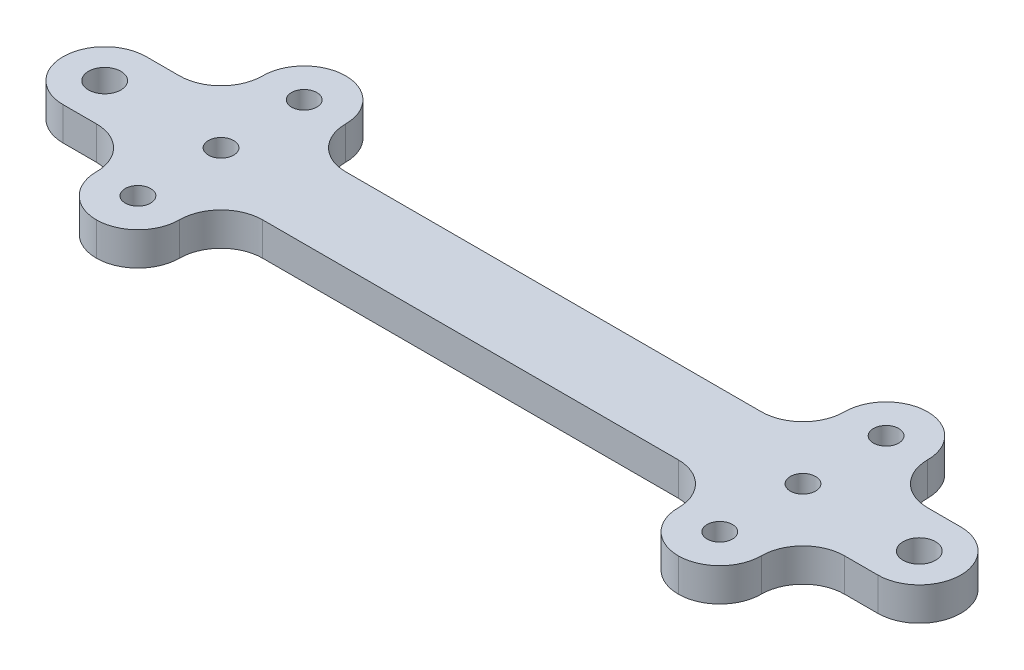
ISO-10303-21;
HEADER;
FILE_DESCRIPTION(('STEP AP214'),'2;1');
FILE_NAME('part.step','',(''),(''),'','','');
FILE_SCHEMA(('AUTOMOTIVE_DESIGN { 1 0 10303 214 1 1 1 1 }'));
ENDSEC;
DATA;
#1=APPLICATION_CONTEXT('core data for automotive mechanical design processes');
#2=APPLICATION_PROTOCOL_DEFINITION('international standard','automotive_design',2000,#1);
#3=PRODUCT_CONTEXT('',#1,'mechanical');
#4=PRODUCT('Part','Part','',(#3));
#5=PRODUCT_RELATED_PRODUCT_CATEGORY('part','',(#4));
#6=PRODUCT_DEFINITION_FORMATION('','',#4);
#7=PRODUCT_DEFINITION_CONTEXT('part definition',#1,'design');
#8=PRODUCT_DEFINITION('design','',#6,#7);
#9=PRODUCT_DEFINITION_SHAPE('','',#8);
#10=(LENGTH_UNIT() NAMED_UNIT(*) SI_UNIT(.MILLI.,.METRE.));
#11=(NAMED_UNIT(*) PLANE_ANGLE_UNIT() SI_UNIT($,.RADIAN.));
#12=(NAMED_UNIT(*) SI_UNIT($,.STERADIAN.) SOLID_ANGLE_UNIT());
#13=UNCERTAINTY_MEASURE_WITH_UNIT(LENGTH_MEASURE(1.E-05),#10,'distance_accuracy_value','');
#14=(GEOMETRIC_REPRESENTATION_CONTEXT(3) GLOBAL_UNCERTAINTY_ASSIGNED_CONTEXT((#13)) GLOBAL_UNIT_ASSIGNED_CONTEXT((#10,
#11,#12)) REPRESENTATION_CONTEXT('',''));
#15=CARTESIAN_POINT('',(0.,0.,0.));
#16=DIRECTION('',(0.,0.,1.));
#17=DIRECTION('',(1.,0.,0.));
#18=AXIS2_PLACEMENT_3D('',#15,#16,#17);
#19=CARTESIAN_POINT('',(-54.1,-23.5,0.));
#20=DIRECTION('',(0.,1.,0.));
#21=DIRECTION('',(0.,0.,1.));
#22=AXIS2_PLACEMENT_3D('',#19,#20,#21);
#23=PLANE('',#22);
#24=CARTESIAN_POINT('',(-40.1,-23.5,0.));
#25=DIRECTION('',(0.,1.,0.));
#26=DIRECTION('',(0.,0.,1.));
#27=AXIS2_PLACEMENT_3D('',#24,#25,#26);
#28=CIRCLE('',#27,1.525);
#29=CARTESIAN_POINT('',(-40.1,-23.5,1.52499999999997));
#30=VERTEX_POINT('',#29);
#31=EDGE_CURVE('E374',#30,#30,#28,.F.);
#32=ORIENTED_EDGE('',*,*,#31,.F.);
#33=EDGE_LOOP('',(#32));
#34=FACE_BOUND('',#33,.T.);
#35=CARTESIAN_POINT('',(-54.1,-23.5,0.));
#36=DIRECTION('',(0.,1.,0.));
#37=DIRECTION('',(0.,0.,1.));
#38=AXIS2_PLACEMENT_3D('',#35,#36,#37);
#39=CIRCLE('',#38,1.95);
#40=CARTESIAN_POINT('',(-54.1,-23.5,1.94999999999997));
#41=VERTEX_POINT('',#40);
#42=EDGE_CURVE('E427',#41,#41,#39,.T.);
#43=ORIENTED_EDGE('',*,*,#42,.T.);
#44=EDGE_LOOP('',(#43));
#45=FACE_BOUND('',#44,.T.);
#46=CARTESIAN_POINT('',(43.9,-23.5,0.));
#47=DIRECTION('',(0.,1.,0.));
#48=DIRECTION('',(0.,0.,1.));
#49=AXIS2_PLACEMENT_3D('',#46,#47,#48);
#50=CIRCLE('',#49,1.95);
#51=CARTESIAN_POINT('',(43.9,-23.5,1.94999999999997));
#52=VERTEX_POINT('',#51);
#53=EDGE_CURVE('E420',#52,#52,#50,.T.);
#54=ORIENTED_EDGE('',*,*,#53,.T.);
#55=EDGE_LOOP('',(#54));
#56=FACE_BOUND('',#55,.T.);
#57=CARTESIAN_POINT('',(29.9,-23.5,9.99999999999998));
#58=DIRECTION('',(0.,1.,0.));
#59=DIRECTION('',(0.,0.,1.));
#60=AXIS2_PLACEMENT_3D('',#57,#58,#59);
#61=CIRCLE('',#60,5.);
#62=CARTESIAN_POINT('',(34.9,-23.5,9.99999999999999));
#63=VERTEX_POINT('',#62);
#64=CARTESIAN_POINT('',(29.9,-23.5,15.));
#65=VERTEX_POINT('',#64);
#66=EDGE_CURVE('E319',#63,#65,#61,.F.);
#67=ORIENTED_EDGE('',*,*,#66,.T.);
#68=CARTESIAN_POINT('',(29.9,-23.5,9.99999999999998));
#69=DIRECTION('',(0.,1.,0.));
#70=DIRECTION('',(0.,0.,1.));
#71=AXIS2_PLACEMENT_3D('',#68,#69,#70);
#72=CIRCLE('',#71,5.);
#73=CARTESIAN_POINT('',(24.9,-23.5,9.99999999999999));
#74=VERTEX_POINT('',#73);
#75=EDGE_CURVE('E321',#65,#74,#72,.F.);
#76=ORIENTED_EDGE('',*,*,#75,.T.);
#77=CARTESIAN_POINT('',(19.9,-23.5,10.0000000000001));
#78=DIRECTION('',(0.,1.,0.));
#79=DIRECTION('',(0.,0.,1.));
#80=AXIS2_PLACEMENT_3D('',#77,#78,#79);
#81=CIRCLE('',#80,5.);
#82=CARTESIAN_POINT('',(19.9,-23.5,5.00000000000009));
#83=VERTEX_POINT('',#82);
#84=EDGE_CURVE('E339',#74,#83,#81,.T.);
#85=ORIENTED_EDGE('',*,*,#84,.T.);
#86=DIRECTION('',(-1.,0.,0.));
#87=VECTOR('',#86,1.);
#88=CARTESIAN_POINT('',(-54.1,-23.5,5.00000000000009));
#89=LINE('',#88,#87);
#90=CARTESIAN_POINT('',(-30.1,-23.5,5.00000000000009));
#91=VERTEX_POINT('',#90);
#92=EDGE_CURVE('E241',#83,#91,#89,.T.);
#93=ORIENTED_EDGE('',*,*,#92,.T.);
#94=CARTESIAN_POINT('',(-30.1,-23.5,10.0000000000001));
#95=DIRECTION('',(0.,1.,0.));
#96=DIRECTION('',(0.,0.,1.));
#97=AXIS2_PLACEMENT_3D('',#94,#95,#96);
#98=CIRCLE('',#97,5.);
#99=CARTESIAN_POINT('',(-35.1,-23.5,9.99999999999998));
#100=VERTEX_POINT('',#99);
#101=EDGE_CURVE('E12',#91,#100,#98,.T.);
#102=ORIENTED_EDGE('',*,*,#101,.T.);
#103=CARTESIAN_POINT('',(-40.1,-23.5,9.99999999999998));
#104=DIRECTION('',(0.,1.,0.));
#105=DIRECTION('',(0.,0.,1.));
#106=AXIS2_PLACEMENT_3D('',#103,#104,#105);
#107=CIRCLE('',#106,5.);
#108=CARTESIAN_POINT('',(-40.1,-23.5,15.));
#109=VERTEX_POINT('',#108);
#110=EDGE_CURVE('E308',#100,#109,#107,.F.);
#111=ORIENTED_EDGE('',*,*,#110,.T.);
#112=CARTESIAN_POINT('',(-40.1,-23.5,9.99999999999998));
#113=DIRECTION('',(0.,1.,0.));
#114=DIRECTION('',(0.,0.,1.));
#115=AXIS2_PLACEMENT_3D('',#112,#113,#114);
#116=CIRCLE('',#115,5.);
#117=CARTESIAN_POINT('',(-45.1,-23.5,9.99999999999999));
#118=VERTEX_POINT('',#117);
#119=EDGE_CURVE('E310',#109,#118,#116,.F.);
#120=ORIENTED_EDGE('',*,*,#119,.T.);
#121=CARTESIAN_POINT('',(-50.1,-23.5,10.0000000000001));
#122=DIRECTION('',(0.,1.,0.));
#123=DIRECTION('',(0.,0.,1.));
#124=AXIS2_PLACEMENT_3D('',#121,#122,#123);
#125=CIRCLE('',#124,5.);
#126=CARTESIAN_POINT('',(-50.1,-23.5,5.00000000000009));
#127=VERTEX_POINT('',#126);
#128=EDGE_CURVE('E237',#118,#127,#125,.T.);
#129=ORIENTED_EDGE('',*,*,#128,.T.);
#130=CARTESIAN_POINT('',(-54.1,-23.5,4.99999999999997));
#131=VERTEX_POINT('',#130);
#132=EDGE_CURVE('E230',#127,#131,#89,.T.);
#133=ORIENTED_EDGE('',*,*,#132,.T.);
#134=CARTESIAN_POINT('',(-54.1,-23.5,0.));
#135=DIRECTION('',(0.,1.,0.));
#136=DIRECTION('',(0.,0.,1.));
#137=AXIS2_PLACEMENT_3D('',#134,#135,#136);
#138=CIRCLE('',#137,5.);
#139=CARTESIAN_POINT('',(-54.1,-23.5,-4.99999999999997));
#140=VERTEX_POINT('',#139);
#141=EDGE_CURVE('E235',#140,#131,#138,.T.);
#142=ORIENTED_EDGE('',*,*,#141,.F.);
#143=DIRECTION('',(-1.,0.,0.));
#144=VECTOR('',#143,1.);
#145=CARTESIAN_POINT('',(-54.1,-23.5,-4.99999999999997));
#146=LINE('',#145,#144);
#147=CARTESIAN_POINT('',(-50.1,-23.5,-4.99999999999997));
#148=VERTEX_POINT('',#147);
#149=EDGE_CURVE('E259',#148,#140,#146,.T.);
#150=ORIENTED_EDGE('',*,*,#149,.F.);
#151=CARTESIAN_POINT('',(-50.1,-23.5,-9.99999999999997));
#152=DIRECTION('',(0.,1.,0.));
#153=DIRECTION('',(0.,0.,1.));
#154=AXIS2_PLACEMENT_3D('',#151,#152,#153);
#155=CIRCLE('',#154,5.);
#156=CARTESIAN_POINT('',(-45.1,-23.5,-10.));
#157=VERTEX_POINT('',#156);
#158=EDGE_CURVE('E358',#148,#157,#155,.T.);
#159=ORIENTED_EDGE('',*,*,#158,.T.);
#160=CARTESIAN_POINT('',(-40.1,-23.5,-10.));
#161=DIRECTION('',(0.,1.,0.));
#162=DIRECTION('',(0.,0.,1.));
#163=AXIS2_PLACEMENT_3D('',#160,#161,#162);
#164=CIRCLE('',#163,5.);
#165=CARTESIAN_POINT('',(-40.1,-23.5,-15.));
#166=VERTEX_POINT('',#165);
#167=EDGE_CURVE('E312',#157,#166,#164,.F.);
#168=ORIENTED_EDGE('',*,*,#167,.T.);
#169=CARTESIAN_POINT('',(-40.1,-23.5,-10.));
#170=DIRECTION('',(0.,1.,0.));
#171=DIRECTION('',(0.,0.,1.));
#172=AXIS2_PLACEMENT_3D('',#169,#170,#171);
#173=CIRCLE('',#172,5.);
#174=CARTESIAN_POINT('',(-35.1,-23.5,-10.));
#175=VERTEX_POINT('',#174);
#176=EDGE_CURVE('E314',#166,#175,#173,.F.);
#177=ORIENTED_EDGE('',*,*,#176,.T.);
#178=CARTESIAN_POINT('',(-30.1,-23.5,-9.99999999999998));
#179=DIRECTION('',(0.,1.,0.));
#180=DIRECTION('',(0.,0.,1.));
#181=AXIS2_PLACEMENT_3D('',#178,#179,#180);
#182=CIRCLE('',#181,5.);
#183=CARTESIAN_POINT('',(-30.1,-23.5,-4.99999999999998));
#184=VERTEX_POINT('',#183);
#185=EDGE_CURVE('E354',#175,#184,#182,.T.);
#186=ORIENTED_EDGE('',*,*,#185,.T.);
#187=CARTESIAN_POINT('',(19.9,-23.5,-4.99999999999999));
#188=VERTEX_POINT('',#187);
#189=EDGE_CURVE('E261',#188,#184,#146,.T.);
#190=ORIENTED_EDGE('',*,*,#189,.F.);
#191=CARTESIAN_POINT('',(19.9,-23.5,-9.99999999999999));
#192=DIRECTION('',(0.,1.,0.));
#193=DIRECTION('',(0.,0.,1.));
#194=AXIS2_PLACEMENT_3D('',#191,#192,#193);
#195=CIRCLE('',#194,5.);
#196=CARTESIAN_POINT('',(24.9,-23.5,-10.));
#197=VERTEX_POINT('',#196);
#198=EDGE_CURVE('E350',#188,#197,#195,.T.);
#199=ORIENTED_EDGE('',*,*,#198,.T.);
#200=CARTESIAN_POINT('',(29.9,-23.5,-10.));
#201=DIRECTION('',(0.,1.,0.));
#202=DIRECTION('',(0.,0.,1.));
#203=AXIS2_PLACEMENT_3D('',#200,#201,#202);
#204=CIRCLE('',#203,5.);
#205=CARTESIAN_POINT('',(29.9,-23.5,-15.));
#206=VERTEX_POINT('',#205);
#207=EDGE_CURVE('E316',#197,#206,#204,.F.);
#208=ORIENTED_EDGE('',*,*,#207,.T.);
#209=CARTESIAN_POINT('',(29.9,-23.5,-10.));
#210=DIRECTION('',(0.,1.,0.));
#211=DIRECTION('',(0.,0.,1.));
#212=AXIS2_PLACEMENT_3D('',#209,#210,#211);
#213=CIRCLE('',#212,5.);
#214=CARTESIAN_POINT('',(34.9,-23.5,-10.));
#215=VERTEX_POINT('',#214);
#216=EDGE_CURVE('E91',#206,#215,#213,.F.);
#217=ORIENTED_EDGE('',*,*,#216,.T.);
#218=CARTESIAN_POINT('',(39.9,-23.5,-9.99999999999999));
#219=DIRECTION('',(0.,1.,0.));
#220=DIRECTION('',(0.,0.,1.));
#221=AXIS2_PLACEMENT_3D('',#218,#219,#220);
#222=CIRCLE('',#221,5.);
#223=CARTESIAN_POINT('',(39.9,-23.5,-4.99999999999999));
#224=VERTEX_POINT('',#223);
#225=EDGE_CURVE('E86',#215,#224,#222,.T.);
#226=ORIENTED_EDGE('',*,*,#225,.T.);
#227=CARTESIAN_POINT('',(43.9,-23.5,-5.00000000000002));
#228=VERTEX_POINT('',#227);
#229=EDGE_CURVE('E263',#228,#224,#146,.T.);
#230=ORIENTED_EDGE('',*,*,#229,.F.);
#231=CARTESIAN_POINT('',(43.9,-23.5,0.));
#232=DIRECTION('',(0.,1.,0.));
#233=DIRECTION('',(0.,0.,1.));
#234=AXIS2_PLACEMENT_3D('',#231,#232,#233);
#235=CIRCLE('',#234,5.);
#236=CARTESIAN_POINT('',(43.9,-23.5,4.99999999999997));
#237=VERTEX_POINT('',#236);
#238=EDGE_CURVE('E267',#237,#228,#235,.T.);
#239=ORIENTED_EDGE('',*,*,#238,.F.);
#240=CARTESIAN_POINT('',(39.9,-23.5,5.00000000000009));
#241=VERTEX_POINT('',#240);
#242=EDGE_CURVE('E244',#237,#241,#89,.T.);
#243=ORIENTED_EDGE('',*,*,#242,.T.);
#244=CARTESIAN_POINT('',(39.9,-23.5,10.0000000000001));
#245=DIRECTION('',(0.,1.,0.));
#246=DIRECTION('',(0.,0.,1.));
#247=AXIS2_PLACEMENT_3D('',#244,#245,#246);
#248=CIRCLE('',#247,5.);
#249=EDGE_CURVE('E343',#241,#63,#248,.T.);
#250=ORIENTED_EDGE('',*,*,#249,.T.);
#251=EDGE_LOOP('',(#67,#76,#85,#93,#102,#111,#120,#129,#133,#142,#150,#159,#168,#177,#186,#190,
#199,#208,#217,#226,#230,#239,#243,#250));
#252=FACE_BOUND('',#251,.T.);
#253=CARTESIAN_POINT('',(-40.1,-23.5,9.99999999999996));
#254=DIRECTION('',(0.,1.,0.));
#255=DIRECTION('',(0.,0.,1.));
#256=AXIS2_PLACEMENT_3D('',#253,#254,#255);
#257=CIRCLE('',#256,1.525);
#258=CARTESIAN_POINT('',(-40.1,-23.5,11.525));
#259=VERTEX_POINT('',#258);
#260=EDGE_CURVE('E432',#259,#259,#257,.T.);
#261=ORIENTED_EDGE('',*,*,#260,.T.);
#262=EDGE_LOOP('',(#261));
#263=FACE_BOUND('',#262,.T.);
#264=CARTESIAN_POINT('',(-40.1,-23.5,-9.99999999999998));
#265=DIRECTION('',(0.,1.,0.));
#266=DIRECTION('',(0.,0.,1.));
#267=AXIS2_PLACEMENT_3D('',#264,#265,#266);
#268=CIRCLE('',#267,1.52499999999999);
#269=CARTESIAN_POINT('',(-40.1,-23.5,-8.47499999999999));
#270=VERTEX_POINT('',#269);
#271=EDGE_CURVE('E441',#270,#270,#268,.F.);
#272=ORIENTED_EDGE('',*,*,#271,.F.);
#273=EDGE_LOOP('',(#272));
#274=FACE_BOUND('',#273,.T.);
#275=CARTESIAN_POINT('',(29.9,-23.5,-10.));
#276=DIRECTION('',(0.,1.,0.));
#277=DIRECTION('',(0.,0.,1.));
#278=AXIS2_PLACEMENT_3D('',#275,#276,#277);
#279=CIRCLE('',#278,1.525);
#280=CARTESIAN_POINT('',(29.9,-23.5,-8.475));
#281=VERTEX_POINT('',#280);
#282=EDGE_CURVE('E444',#281,#281,#279,.T.);
#283=ORIENTED_EDGE('',*,*,#282,.T.);
#284=EDGE_LOOP('',(#283));
#285=FACE_BOUND('',#284,.T.);
#286=CARTESIAN_POINT('',(29.9,-23.5,9.99999999999996));
#287=DIRECTION('',(0.,1.,0.));
#288=DIRECTION('',(0.,0.,1.));
#289=AXIS2_PLACEMENT_3D('',#286,#287,#288);
#290=CIRCLE('',#289,1.525);
#291=CARTESIAN_POINT('',(29.9,-23.5,11.525));
#292=VERTEX_POINT('',#291);
#293=EDGE_CURVE('E452',#292,#292,#290,.F.);
#294=ORIENTED_EDGE('',*,*,#293,.F.);
#295=EDGE_LOOP('',(#294));
#296=FACE_BOUND('',#295,.T.);
#297=CARTESIAN_POINT('',(29.9,-23.5,0.));
#298=DIRECTION('',(0.,1.,0.));
#299=DIRECTION('',(0.,0.,1.));
#300=AXIS2_PLACEMENT_3D('',#297,#298,#299);
#301=CIRCLE('',#300,1.525);
#302=CARTESIAN_POINT('',(29.9,-23.5,1.52499999999997));
#303=VERTEX_POINT('',#302);
#304=EDGE_CURVE('E456',#303,#303,#301,.T.);
#305=ORIENTED_EDGE('',*,*,#304,.T.);
#306=EDGE_LOOP('',(#305));
#307=FACE_BOUND('',#306,.T.);
#308=ADVANCED_FACE('F69',(#34,#45,#56,#252,#263,#274,#285,#296,#307),#23,.F.);
#309=CARTESIAN_POINT('',(-54.1,-19.5,0.));
#310=DIRECTION('',(0.,1.,0.));
#311=DIRECTION('',(0.,0.,1.));
#312=AXIS2_PLACEMENT_3D('',#309,#310,#311);
#313=PLANE('',#312);
#314=CARTESIAN_POINT('',(29.9,-19.5,9.99999999999996));
#315=DIRECTION('',(0.,1.,0.));
#316=DIRECTION('',(0.,0.,1.));
#317=AXIS2_PLACEMENT_3D('',#314,#315,#316);
#318=CIRCLE('',#317,1.525);
#319=CARTESIAN_POINT('',(29.9,-19.5,11.525));
#320=VERTEX_POINT('',#319);
#321=EDGE_CURVE('E453',#320,#320,#318,.T.);
#322=ORIENTED_EDGE('',*,*,#321,.F.);
#323=EDGE_LOOP('',(#322));
#324=FACE_BOUND('',#323,.T.);
#325=CARTESIAN_POINT('',(29.9,-19.5,-10.));
#326=DIRECTION('',(0.,1.,0.));
#327=DIRECTION('',(0.,0.,1.));
#328=AXIS2_PLACEMENT_3D('',#325,#326,#327);
#329=CIRCLE('',#328,1.525);
#330=CARTESIAN_POINT('',(29.9,-19.5,-8.475));
#331=VERTEX_POINT('',#330);
#332=EDGE_CURVE('E449',#331,#331,#329,.F.);
#333=ORIENTED_EDGE('',*,*,#332,.T.);
#334=EDGE_LOOP('',(#333));
#335=FACE_BOUND('',#334,.T.);
#336=CARTESIAN_POINT('',(-40.1,-19.5,-9.99999999999998));
#337=DIRECTION('',(0.,1.,0.));
#338=DIRECTION('',(0.,0.,1.));
#339=AXIS2_PLACEMENT_3D('',#336,#337,#338);
#340=CIRCLE('',#339,1.52499999999999);
#341=CARTESIAN_POINT('',(-40.1,-19.5,-8.47499999999999));
#342=VERTEX_POINT('',#341);
#343=EDGE_CURVE('E440',#342,#342,#340,.T.);
#344=ORIENTED_EDGE('',*,*,#343,.F.);
#345=EDGE_LOOP('',(#344));
#346=FACE_BOUND('',#345,.T.);
#347=CARTESIAN_POINT('',(-40.1,-19.5,9.99999999999996));
#348=DIRECTION('',(0.,1.,0.));
#349=DIRECTION('',(0.,0.,1.));
#350=AXIS2_PLACEMENT_3D('',#347,#348,#349);
#351=CIRCLE('',#350,1.525);
#352=CARTESIAN_POINT('',(-40.1,-19.5,11.525));
#353=VERTEX_POINT('',#352);
#354=EDGE_CURVE('E437',#353,#353,#351,.F.);
#355=ORIENTED_EDGE('',*,*,#354,.T.);
#356=EDGE_LOOP('',(#355));
#357=FACE_BOUND('',#356,.T.);
#358=DIRECTION('',(-1.,0.,0.));
#359=VECTOR('',#358,1.);
#360=CARTESIAN_POINT('',(-54.1,-19.5,5.00000000000009));
#361=LINE('',#360,#359);
#362=CARTESIAN_POINT('',(19.9,-19.5,5.00000000000009));
#363=VERTEX_POINT('',#362);
#364=CARTESIAN_POINT('',(-30.1,-19.5,5.00000000000009));
#365=VERTEX_POINT('',#364);
#366=EDGE_CURVE('E275',#363,#365,#361,.T.);
#367=ORIENTED_EDGE('',*,*,#366,.F.);
#368=CARTESIAN_POINT('',(19.9,-19.5,10.0000000000001));
#369=DIRECTION('',(0.,1.,0.));
#370=DIRECTION('',(0.,0.,1.));
#371=AXIS2_PLACEMENT_3D('',#368,#369,#370);
#372=CIRCLE('',#371,5.);
#373=CARTESIAN_POINT('',(24.9,-19.5,9.99999999999999));
#374=VERTEX_POINT('',#373);
#375=EDGE_CURVE('E337',#363,#374,#372,.F.);
#376=ORIENTED_EDGE('',*,*,#375,.T.);
#377=CARTESIAN_POINT('',(29.9,-19.5,9.99999999999998));
#378=DIRECTION('',(0.,1.,0.));
#379=DIRECTION('',(0.,0.,1.));
#380=AXIS2_PLACEMENT_3D('',#377,#378,#379);
#381=CIRCLE('',#380,5.);
#382=CARTESIAN_POINT('',(29.9,-19.5,15.));
#383=VERTEX_POINT('',#382);
#384=EDGE_CURVE('E306',#374,#383,#381,.T.);
#385=ORIENTED_EDGE('',*,*,#384,.T.);
#386=CARTESIAN_POINT('',(29.9,-19.5,9.99999999999998));
#387=DIRECTION('',(0.,1.,0.));
#388=DIRECTION('',(0.,0.,1.));
#389=AXIS2_PLACEMENT_3D('',#386,#387,#388);
#390=CIRCLE('',#389,5.);
#391=CARTESIAN_POINT('',(34.9,-19.5,9.99999999999999));
#392=VERTEX_POINT('',#391);
#393=EDGE_CURVE('E304',#383,#392,#390,.T.);
#394=ORIENTED_EDGE('',*,*,#393,.T.);
#395=CARTESIAN_POINT('',(39.9,-19.5,10.0000000000001));
#396=DIRECTION('',(0.,1.,0.));
#397=DIRECTION('',(0.,0.,1.));
#398=AXIS2_PLACEMENT_3D('',#395,#396,#397);
#399=CIRCLE('',#398,5.);
#400=CARTESIAN_POINT('',(39.9,-19.5,5.00000000000009));
#401=VERTEX_POINT('',#400);
#402=EDGE_CURVE('E341',#392,#401,#399,.F.);
#403=ORIENTED_EDGE('',*,*,#402,.T.);
#404=CARTESIAN_POINT('',(43.9,-19.5,4.99999999999997));
#405=VERTEX_POINT('',#404);
#406=EDGE_CURVE('E271',#405,#401,#361,.T.);
#407=ORIENTED_EDGE('',*,*,#406,.F.);
#408=CARTESIAN_POINT('',(43.9,-19.5,0.));
#409=DIRECTION('',(0.,1.,0.));
#410=DIRECTION('',(0.,0.,1.));
#411=AXIS2_PLACEMENT_3D('',#408,#409,#410);
#412=CIRCLE('',#411,5.);
#413=CARTESIAN_POINT('',(43.9,-19.5,-5.00000000000002));
#414=VERTEX_POINT('',#413);
#415=EDGE_CURVE('E242',#405,#414,#412,.T.);
#416=ORIENTED_EDGE('',*,*,#415,.T.);
#417=DIRECTION('',(-1.,0.,0.));
#418=VECTOR('',#417,1.);
#419=CARTESIAN_POINT('',(-54.1,-19.5,-4.99999999999997));
#420=LINE('',#419,#418);
#421=CARTESIAN_POINT('',(39.9,-19.5,-4.99999999999999));
#422=VERTEX_POINT('',#421);
#423=EDGE_CURVE('E278',#414,#422,#420,.T.);
#424=ORIENTED_EDGE('',*,*,#423,.T.);
#425=CARTESIAN_POINT('',(39.9,-19.5,-9.99999999999999));
#426=DIRECTION('',(0.,1.,0.));
#427=DIRECTION('',(0.,0.,1.));
#428=AXIS2_PLACEMENT_3D('',#425,#426,#427);
#429=CIRCLE('',#428,5.);
#430=CARTESIAN_POINT('',(34.9,-19.5,-10.));
#431=VERTEX_POINT('',#430);
#432=EDGE_CURVE('E345',#422,#431,#429,.F.);
#433=ORIENTED_EDGE('',*,*,#432,.T.);
#434=CARTESIAN_POINT('',(29.9,-19.5,-10.));
#435=DIRECTION('',(0.,1.,0.));
#436=DIRECTION('',(0.,0.,1.));
#437=AXIS2_PLACEMENT_3D('',#434,#435,#436);
#438=CIRCLE('',#437,5.);
#439=CARTESIAN_POINT('',(29.9,-19.5,-15.));
#440=VERTEX_POINT('',#439);
#441=EDGE_CURVE('E302',#431,#440,#438,.T.);
#442=ORIENTED_EDGE('',*,*,#441,.T.);
#443=CARTESIAN_POINT('',(29.9,-19.5,-10.));
#444=DIRECTION('',(0.,1.,0.));
#445=DIRECTION('',(0.,0.,1.));
#446=AXIS2_PLACEMENT_3D('',#443,#444,#445);
#447=CIRCLE('',#446,5.);
#448=CARTESIAN_POINT('',(24.9,-19.5,-10.));
#449=VERTEX_POINT('',#448);
#450=EDGE_CURVE('E300',#440,#449,#447,.T.);
#451=ORIENTED_EDGE('',*,*,#450,.T.);
#452=CARTESIAN_POINT('',(19.9,-19.5,-9.99999999999999));
#453=DIRECTION('',(0.,1.,0.));
#454=DIRECTION('',(0.,0.,1.));
#455=AXIS2_PLACEMENT_3D('',#452,#453,#454);
#456=CIRCLE('',#455,5.);
#457=CARTESIAN_POINT('',(19.9,-19.5,-4.99999999999999));
#458=VERTEX_POINT('',#457);
#459=EDGE_CURVE('E348',#449,#458,#456,.F.);
#460=ORIENTED_EDGE('',*,*,#459,.T.);
#461=CARTESIAN_POINT('',(-30.1,-19.5,-4.99999999999998));
#462=VERTEX_POINT('',#461);
#463=EDGE_CURVE('E281',#458,#462,#420,.T.);
#464=ORIENTED_EDGE('',*,*,#463,.T.);
#465=CARTESIAN_POINT('',(-30.1,-19.5,-9.99999999999998));
#466=DIRECTION('',(0.,1.,0.));
#467=DIRECTION('',(0.,0.,1.));
#468=AXIS2_PLACEMENT_3D('',#465,#466,#467);
#469=CIRCLE('',#468,5.);
#470=CARTESIAN_POINT('',(-35.1,-19.5,-10.));
#471=VERTEX_POINT('',#470);
#472=EDGE_CURVE('E352',#462,#471,#469,.F.);
#473=ORIENTED_EDGE('',*,*,#472,.T.);
#474=CARTESIAN_POINT('',(-40.1,-19.5,-10.));
#475=DIRECTION('',(0.,1.,0.));
#476=DIRECTION('',(0.,0.,1.));
#477=AXIS2_PLACEMENT_3D('',#474,#475,#476);
#478=CIRCLE('',#477,5.);
#479=CARTESIAN_POINT('',(-40.1,-19.5,-15.));
#480=VERTEX_POINT('',#479);
#481=EDGE_CURVE('E298',#471,#480,#478,.T.);
#482=ORIENTED_EDGE('',*,*,#481,.T.);
#483=CARTESIAN_POINT('',(-40.1,-19.5,-10.));
#484=DIRECTION('',(0.,1.,0.));
#485=DIRECTION('',(0.,0.,1.));
#486=AXIS2_PLACEMENT_3D('',#483,#484,#485);
#487=CIRCLE('',#486,5.);
#488=CARTESIAN_POINT('',(-45.1,-19.5,-10.));
#489=VERTEX_POINT('',#488);
#490=EDGE_CURVE('E296',#480,#489,#487,.T.);
#491=ORIENTED_EDGE('',*,*,#490,.T.);
#492=CARTESIAN_POINT('',(-50.1,-19.5,-9.99999999999997));
#493=DIRECTION('',(0.,1.,0.));
#494=DIRECTION('',(0.,0.,1.));
#495=AXIS2_PLACEMENT_3D('',#492,#493,#494);
#496=CIRCLE('',#495,5.);
#497=CARTESIAN_POINT('',(-50.1,-19.5,-4.99999999999997));
#498=VERTEX_POINT('',#497);
#499=EDGE_CURVE('E356',#489,#498,#496,.F.);
#500=ORIENTED_EDGE('',*,*,#499,.T.);
#501=CARTESIAN_POINT('',(-54.1,-19.5,-4.99999999999997));
#502=VERTEX_POINT('',#501);
#503=EDGE_CURVE('E277',#498,#502,#420,.T.);
#504=ORIENTED_EDGE('',*,*,#503,.T.);
#505=CARTESIAN_POINT('',(-54.1,-19.5,0.));
#506=DIRECTION('',(0.,1.,0.));
#507=DIRECTION('',(0.,0.,1.));
#508=AXIS2_PLACEMENT_3D('',#505,#506,#507);
#509=CIRCLE('',#508,5.);
#510=CARTESIAN_POINT('',(-54.1,-19.5,4.99999999999997));
#511=VERTEX_POINT('',#510);
#512=EDGE_CURVE('E274',#502,#511,#509,.T.);
#513=ORIENTED_EDGE('',*,*,#512,.T.);
#514=CARTESIAN_POINT('',(-50.1,-19.5,5.00000000000009));
#515=VERTEX_POINT('',#514);
#516=EDGE_CURVE('E249',#515,#511,#361,.T.);
#517=ORIENTED_EDGE('',*,*,#516,.F.);
#518=CARTESIAN_POINT('',(-50.1,-19.5,10.0000000000001));
#519=DIRECTION('',(0.,1.,0.));
#520=DIRECTION('',(0.,0.,1.));
#521=AXIS2_PLACEMENT_3D('',#518,#519,#520);
#522=CIRCLE('',#521,5.);
#523=CARTESIAN_POINT('',(-45.1,-19.5,9.99999999999999));
#524=VERTEX_POINT('',#523);
#525=EDGE_CURVE('E360',#515,#524,#522,.F.);
#526=ORIENTED_EDGE('',*,*,#525,.T.);
#527=CARTESIAN_POINT('',(-40.1,-19.5,9.99999999999998));
#528=DIRECTION('',(0.,1.,0.));
#529=DIRECTION('',(0.,0.,1.));
#530=AXIS2_PLACEMENT_3D('',#527,#528,#529);
#531=CIRCLE('',#530,5.);
#532=CARTESIAN_POINT('',(-40.1,-19.5,15.));
#533=VERTEX_POINT('',#532);
#534=EDGE_CURVE('E294',#524,#533,#531,.T.);
#535=ORIENTED_EDGE('',*,*,#534,.T.);
#536=CARTESIAN_POINT('',(-40.1,-19.5,9.99999999999998));
#537=DIRECTION('',(0.,1.,0.));
#538=DIRECTION('',(0.,0.,1.));
#539=AXIS2_PLACEMENT_3D('',#536,#537,#538);
#540=CIRCLE('',#539,5.);
#541=CARTESIAN_POINT('',(-35.1,-19.5,9.99999999999998));
#542=VERTEX_POINT('',#541);
#543=EDGE_CURVE('E292',#533,#542,#540,.T.);
#544=ORIENTED_EDGE('',*,*,#543,.T.);
#545=CARTESIAN_POINT('',(-30.1,-19.5,10.0000000000001));
#546=DIRECTION('',(0.,1.,0.));
#547=DIRECTION('',(0.,0.,1.));
#548=AXIS2_PLACEMENT_3D('',#545,#546,#547);
#549=CIRCLE('',#548,5.);
#550=EDGE_CURVE('E78',#542,#365,#549,.F.);
#551=ORIENTED_EDGE('',*,*,#550,.T.);
#552=EDGE_LOOP('',(#367,#376,#385,#394,#403,#407,#416,#424,#433,#442,#451,#460,#464,#473,#482,
#491,#500,#504,#513,#517,#526,#535,#544,#551));
#553=FACE_BOUND('',#552,.T.);
#554=CARTESIAN_POINT('',(43.9,-19.5,0.));
#555=DIRECTION('',(0.,1.,0.));
#556=DIRECTION('',(0.,0.,1.));
#557=AXIS2_PLACEMENT_3D('',#554,#555,#556);
#558=CIRCLE('',#557,1.95);
#559=CARTESIAN_POINT('',(43.9,-19.5,1.94999999999997));
#560=VERTEX_POINT('',#559);
#561=EDGE_CURVE('E422',#560,#560,#558,.T.);
#562=ORIENTED_EDGE('',*,*,#561,.F.);
#563=EDGE_LOOP('',(#562));
#564=FACE_BOUND('',#563,.T.);
#565=CARTESIAN_POINT('',(-54.1,-19.5,0.));
#566=DIRECTION('',(0.,1.,0.));
#567=DIRECTION('',(0.,0.,1.));
#568=AXIS2_PLACEMENT_3D('',#565,#566,#567);
#569=CIRCLE('',#568,1.95);
#570=CARTESIAN_POINT('',(-54.1,-19.5,1.94999999999997));
#571=VERTEX_POINT('',#570);
#572=EDGE_CURVE('E429',#571,#571,#569,.T.);
#573=ORIENTED_EDGE('',*,*,#572,.F.);
#574=EDGE_LOOP('',(#573));
#575=FACE_BOUND('',#574,.T.);
#576=CARTESIAN_POINT('',(-40.1,-19.5,0.));
#577=DIRECTION('',(0.,1.,0.));
#578=DIRECTION('',(0.,0.,1.));
#579=AXIS2_PLACEMENT_3D('',#576,#577,#578);
#580=CIRCLE('',#579,1.525);
#581=CARTESIAN_POINT('',(-40.1,-19.5,1.52499999999997));
#582=VERTEX_POINT('',#581);
#583=EDGE_CURVE('E459',#582,#582,#580,.T.);
#584=ORIENTED_EDGE('',*,*,#583,.F.);
#585=EDGE_LOOP('',(#584));
#586=FACE_BOUND('',#585,.T.);
#587=CARTESIAN_POINT('',(29.9,-19.5,0.));
#588=DIRECTION('',(0.,1.,0.));
#589=DIRECTION('',(0.,0.,1.));
#590=AXIS2_PLACEMENT_3D('',#587,#588,#589);
#591=CIRCLE('',#590,1.525);
#592=CARTESIAN_POINT('',(29.9,-19.5,1.52499999999997));
#593=VERTEX_POINT('',#592);
#594=EDGE_CURVE('E462',#593,#593,#591,.F.);
#595=ORIENTED_EDGE('',*,*,#594,.T.);
#596=EDGE_LOOP('',(#595));
#597=FACE_BOUND('',#596,.T.);
#598=ADVANCED_FACE('F413',(#324,#335,#346,#357,#553,#564,#575,#586,#597),#313,.T.);
#599=CARTESIAN_POINT('',(-54.1,-23.5,5.00000000000009));
#600=DIRECTION('',(0.,0.,-1.));
#601=DIRECTION('',(-1.,0.,0.));
#602=AXIS2_PLACEMENT_3D('',#599,#600,#601);
#603=PLANE('',#602);
#604=ORIENTED_EDGE('',*,*,#406,.T.);
#605=DIRECTION('',(0.,1.,0.));
#606=VECTOR('',#605,1.);
#607=CARTESIAN_POINT('',(39.9,-23.5,5.00000000000009));
#608=LINE('',#607,#606);
#609=EDGE_CURVE('E323',#401,#241,#608,.F.);
#610=ORIENTED_EDGE('',*,*,#609,.T.);
#611=ORIENTED_EDGE('',*,*,#242,.F.);
#612=DIRECTION('',(0.,1.,0.));
#613=VECTOR('',#612,1.);
#614=CARTESIAN_POINT('',(43.9,-23.5,4.99999999999997));
#615=LINE('',#614,#613);
#616=EDGE_CURVE('E270',#237,#405,#615,.T.);
#617=ORIENTED_EDGE('',*,*,#616,.T.);
#618=EDGE_LOOP('',(#604,#610,#611,#617));
#619=FACE_BOUND('',#618,.T.);
#620=ADVANCED_FACE('F494',(#619),#603,.F.);
#621=CARTESIAN_POINT('',(-54.1,-23.5,-4.99999999999997));
#622=DIRECTION('',(0.,0.,-1.));
#623=DIRECTION('',(-1.,0.,0.));
#624=AXIS2_PLACEMENT_3D('',#621,#622,#623);
#625=PLANE('',#624);
#626=ORIENTED_EDGE('',*,*,#463,.F.);
#627=DIRECTION('',(0.,1.,0.));
#628=VECTOR('',#627,1.);
#629=CARTESIAN_POINT('',(19.9,-23.5,-4.99999999999999));
#630=LINE('',#629,#628);
#631=EDGE_CURVE('E331',#458,#188,#630,.F.);
#632=ORIENTED_EDGE('',*,*,#631,.T.);
#633=ORIENTED_EDGE('',*,*,#189,.T.);
#634=DIRECTION('',(0.,1.,0.));
#635=VECTOR('',#634,1.);
#636=CARTESIAN_POINT('',(-30.1,-19.5,-4.99999999999998));
#637=LINE('',#636,#635);
#638=EDGE_CURVE('E328',#184,#462,#637,.T.);
#639=ORIENTED_EDGE('',*,*,#638,.T.);
#640=EDGE_LOOP('',(#626,#632,#633,#639));
#641=FACE_BOUND('',#640,.T.);
#642=ADVANCED_FACE('F511',(#641),#625,.T.);
#643=ORIENTED_EDGE('',*,*,#503,.F.);
#644=DIRECTION('',(0.,1.,0.));
#645=VECTOR('',#644,1.);
#646=CARTESIAN_POINT('',(-50.1,-23.5,-4.99999999999997));
#647=LINE('',#646,#645);
#648=EDGE_CURVE('E333',#498,#148,#647,.F.);
#649=ORIENTED_EDGE('',*,*,#648,.T.);
#650=ORIENTED_EDGE('',*,*,#149,.T.);
#651=DIRECTION('',(0.,1.,0.));
#652=VECTOR('',#651,1.);
#653=CARTESIAN_POINT('',(-54.1,-23.5,-4.99999999999997));
#654=LINE('',#653,#652);
#655=EDGE_CURVE('E254',#140,#502,#654,.T.);
#656=ORIENTED_EDGE('',*,*,#655,.T.);
#657=EDGE_LOOP('',(#643,#649,#650,#656));
#658=FACE_BOUND('',#657,.T.);
#659=ADVANCED_FACE('F512',(#658),#625,.T.);
#660=ORIENTED_EDGE('',*,*,#92,.F.);
#661=DIRECTION('',(0.,1.,0.));
#662=VECTOR('',#661,1.);
#663=CARTESIAN_POINT('',(19.9,-23.5,5.00000000000009));
#664=LINE('',#663,#662);
#665=EDGE_CURVE('E289',#83,#363,#664,.T.);
#666=ORIENTED_EDGE('',*,*,#665,.T.);
#667=ORIENTED_EDGE('',*,*,#366,.T.);
#668=DIRECTION('',(0.,1.,0.));
#669=VECTOR('',#668,1.);
#670=CARTESIAN_POINT('',(-30.1,-23.5,5.00000000000009));
#671=LINE('',#670,#669);
#672=EDGE_CURVE('E253',#365,#91,#671,.F.);
#673=ORIENTED_EDGE('',*,*,#672,.T.);
#674=EDGE_LOOP('',(#660,#666,#667,#673));
#675=FACE_BOUND('',#674,.T.);
#676=ADVANCED_FACE('F417',(#675),#603,.F.);
#677=ORIENTED_EDGE('',*,*,#132,.F.);
#678=DIRECTION('',(0.,1.,0.));
#679=VECTOR('',#678,1.);
#680=CARTESIAN_POINT('',(-50.1,-23.5,5.00000000000009));
#681=LINE('',#680,#679);
#682=EDGE_CURVE('E335',#127,#515,#681,.T.);
#683=ORIENTED_EDGE('',*,*,#682,.T.);
#684=ORIENTED_EDGE('',*,*,#516,.T.);
#685=DIRECTION('',(0.,1.,0.));
#686=VECTOR('',#685,1.);
#687=CARTESIAN_POINT('',(-54.1,-23.5,4.99999999999997));
#688=LINE('',#687,#686);
#689=EDGE_CURVE('E246',#131,#511,#688,.T.);
#690=ORIENTED_EDGE('',*,*,#689,.F.);
#691=EDGE_LOOP('',(#677,#683,#684,#690));
#692=FACE_BOUND('',#691,.T.);
#693=ADVANCED_FACE('F247',(#692),#603,.F.);
#694=CARTESIAN_POINT('',(-54.1,-23.5,0.));
#695=DIRECTION('',(0.,1.,0.));
#696=DIRECTION('',(0.,0.,1.));
#697=AXIS2_PLACEMENT_3D('',#694,#695,#696);
#698=CYLINDRICAL_SURFACE('',#697,5.);
#699=ORIENTED_EDGE('',*,*,#512,.F.);
#700=ORIENTED_EDGE('',*,*,#655,.F.);
#701=ORIENTED_EDGE('',*,*,#141,.T.);
#702=ORIENTED_EDGE('',*,*,#689,.T.);
#703=EDGE_LOOP('',(#699,#700,#701,#702));
#704=FACE_BOUND('',#703,.T.);
#705=ADVANCED_FACE('F257',(#704),#698,.T.);
#706=ORIENTED_EDGE('',*,*,#229,.T.);
#707=DIRECTION('',(0.,1.,0.));
#708=VECTOR('',#707,1.);
#709=CARTESIAN_POINT('',(39.9,-19.5,-4.99999999999999));
#710=LINE('',#709,#708);
#711=EDGE_CURVE('E325',#224,#422,#710,.T.);
#712=ORIENTED_EDGE('',*,*,#711,.T.);
#713=ORIENTED_EDGE('',*,*,#423,.F.);
#714=DIRECTION('',(0.,1.,0.));
#715=VECTOR('',#714,1.);
#716=CARTESIAN_POINT('',(43.9,-23.5,-5.00000000000002));
#717=LINE('',#716,#715);
#718=EDGE_CURVE('E285',#228,#414,#717,.T.);
#719=ORIENTED_EDGE('',*,*,#718,.F.);
#720=EDGE_LOOP('',(#706,#712,#713,#719));
#721=FACE_BOUND('',#720,.T.);
#722=ADVANCED_FACE('F506',(#721),#625,.T.);
#723=CARTESIAN_POINT('',(43.9,-23.5,0.));
#724=DIRECTION('',(0.,1.,0.));
#725=DIRECTION('',(0.,0.,1.));
#726=AXIS2_PLACEMENT_3D('',#723,#724,#725);
#727=CYLINDRICAL_SURFACE('',#726,5.);
#728=ORIENTED_EDGE('',*,*,#415,.F.);
#729=ORIENTED_EDGE('',*,*,#616,.F.);
#730=ORIENTED_EDGE('',*,*,#238,.T.);
#731=ORIENTED_EDGE('',*,*,#718,.T.);
#732=EDGE_LOOP('',(#728,#729,#730,#731));
#733=FACE_BOUND('',#732,.T.);
#734=ADVANCED_FACE('F503',(#733),#727,.T.);
#735=CARTESIAN_POINT('',(43.9,-23.5,0.));
#736=DIRECTION('',(0.,1.,0.));
#737=DIRECTION('',(0.,0.,1.));
#738=AXIS2_PLACEMENT_3D('',#735,#736,#737);
#739=CYLINDRICAL_SURFACE('',#738,1.95);
#740=ORIENTED_EDGE('',*,*,#53,.F.);
#741=EDGE_LOOP('',(#740));
#742=FACE_BOUND('',#741,.T.);
#743=ORIENTED_EDGE('',*,*,#561,.T.);
#744=EDGE_LOOP('',(#743));
#745=FACE_BOUND('',#744,.T.);
#746=ADVANCED_FACE('F500',(#742,#745),#739,.F.);
#747=CARTESIAN_POINT('',(-54.1,-23.5,0.));
#748=DIRECTION('',(0.,1.,0.));
#749=DIRECTION('',(0.,0.,1.));
#750=AXIS2_PLACEMENT_3D('',#747,#748,#749);
#751=CYLINDRICAL_SURFACE('',#750,1.95);
#752=ORIENTED_EDGE('',*,*,#42,.F.);
#753=EDGE_LOOP('',(#752));
#754=FACE_BOUND('',#753,.T.);
#755=ORIENTED_EDGE('',*,*,#572,.T.);
#756=EDGE_LOOP('',(#755));
#757=FACE_BOUND('',#756,.T.);
#758=ADVANCED_FACE('F760',(#754,#757),#751,.F.);
#759=CARTESIAN_POINT('',(-40.1,-37.642135623731,9.99999999999996));
#760=DIRECTION('',(0.,1.,0.));
#761=DIRECTION('',(0.,0.,1.));
#762=AXIS2_PLACEMENT_3D('',#759,#760,#761);
#763=CYLINDRICAL_SURFACE('',#762,1.525);
#764=ORIENTED_EDGE('',*,*,#260,.F.);
#765=EDGE_LOOP('',(#764));
#766=FACE_BOUND('',#765,.T.);
#767=ORIENTED_EDGE('',*,*,#354,.F.);
#768=EDGE_LOOP('',(#767));
#769=FACE_BOUND('',#768,.T.);
#770=ADVANCED_FACE('F752',(#766,#769),#763,.F.);
#771=CARTESIAN_POINT('',(-40.1,-37.642135623731,-9.99999999999998));
#772=DIRECTION('',(0.,1.,0.));
#773=DIRECTION('',(0.,0.,1.));
#774=AXIS2_PLACEMENT_3D('',#771,#772,#773);
#775=CYLINDRICAL_SURFACE('',#774,1.52499999999999);
#776=ORIENTED_EDGE('',*,*,#271,.T.);
#777=EDGE_LOOP('',(#776));
#778=FACE_BOUND('',#777,.T.);
#779=ORIENTED_EDGE('',*,*,#343,.T.);
#780=EDGE_LOOP('',(#779));
#781=FACE_BOUND('',#780,.T.);
#782=ADVANCED_FACE('F744',(#778,#781),#775,.F.);
#783=CARTESIAN_POINT('',(29.9,-37.642135623731,-10.));
#784=DIRECTION('',(0.,1.,0.));
#785=DIRECTION('',(0.,0.,1.));
#786=AXIS2_PLACEMENT_3D('',#783,#784,#785);
#787=CYLINDRICAL_SURFACE('',#786,1.525);
#788=ORIENTED_EDGE('',*,*,#282,.F.);
#789=EDGE_LOOP('',(#788));
#790=FACE_BOUND('',#789,.T.);
#791=ORIENTED_EDGE('',*,*,#332,.F.);
#792=EDGE_LOOP('',(#791));
#793=FACE_BOUND('',#792,.T.);
#794=ADVANCED_FACE('F735',(#790,#793),#787,.F.);
#795=CARTESIAN_POINT('',(29.9,-37.642135623731,9.99999999999996));
#796=DIRECTION('',(0.,1.,0.));
#797=DIRECTION('',(0.,0.,1.));
#798=AXIS2_PLACEMENT_3D('',#795,#796,#797);
#799=CYLINDRICAL_SURFACE('',#798,1.525);
#800=ORIENTED_EDGE('',*,*,#293,.T.);
#801=EDGE_LOOP('',(#800));
#802=FACE_BOUND('',#801,.T.);
#803=ORIENTED_EDGE('',*,*,#321,.T.);
#804=EDGE_LOOP('',(#803));
#805=FACE_BOUND('',#804,.T.);
#806=ADVANCED_FACE('F485',(#802,#805),#799,.F.);
#807=CARTESIAN_POINT('',(-40.1,-27.8133513652379,0.));
#808=DIRECTION('',(0.,1.,0.));
#809=DIRECTION('',(0.,0.,1.));
#810=AXIS2_PLACEMENT_3D('',#807,#808,#809);
#811=CYLINDRICAL_SURFACE('',#810,1.525);
#812=ORIENTED_EDGE('',*,*,#31,.T.);
#813=EDGE_LOOP('',(#812));
#814=FACE_BOUND('',#813,.T.);
#815=ORIENTED_EDGE('',*,*,#583,.T.);
#816=EDGE_LOOP('',(#815));
#817=FACE_BOUND('',#816,.T.);
#818=ADVANCED_FACE('F474',(#814,#817),#811,.F.);
#819=CARTESIAN_POINT('',(29.9,-27.8133513652379,0.));
#820=DIRECTION('',(0.,1.,0.));
#821=DIRECTION('',(0.,0.,1.));
#822=AXIS2_PLACEMENT_3D('',#819,#820,#821);
#823=CYLINDRICAL_SURFACE('',#822,1.525);
#824=ORIENTED_EDGE('',*,*,#304,.F.);
#825=EDGE_LOOP('',(#824));
#826=FACE_BOUND('',#825,.T.);
#827=ORIENTED_EDGE('',*,*,#594,.F.);
#828=EDGE_LOOP('',(#827));
#829=FACE_BOUND('',#828,.T.);
#830=ADVANCED_FACE('F471',(#826,#829),#823,.F.);
#831=CARTESIAN_POINT('',(39.9,-37.642135623731,10.0000000000001));
#832=DIRECTION('',(0.,-1.,0.));
#833=DIRECTION('',(0.,0.,-1.));
#834=AXIS2_PLACEMENT_3D('',#831,#832,#833);
#835=CYLINDRICAL_SURFACE('',#834,5.);
#836=ORIENTED_EDGE('',*,*,#609,.F.);
#837=ORIENTED_EDGE('',*,*,#402,.F.);
#838=DIRECTION('',(0.,1.,0.));
#839=VECTOR('',#838,1.);
#840=CARTESIAN_POINT('',(34.9,-19.5,10.0000000000001));
#841=LINE('',#840,#839);
#842=EDGE_CURVE('E371',#63,#392,#841,.T.);
#843=ORIENTED_EDGE('',*,*,#842,.F.);
#844=ORIENTED_EDGE('',*,*,#249,.F.);
#845=EDGE_LOOP('',(#836,#837,#843,#844));
#846=FACE_BOUND('',#845,.T.);
#847=ADVANCED_FACE('F473',(#846),#835,.F.);
#848=CARTESIAN_POINT('',(29.9,-37.642135623731,9.99999999999998));
#849=DIRECTION('',(0.,1.,0.));
#850=DIRECTION('',(0.,0.,1.));
#851=AXIS2_PLACEMENT_3D('',#848,#849,#850);
#852=CYLINDRICAL_SURFACE('',#851,5.);
#853=ORIENTED_EDGE('',*,*,#842,.T.);
#854=ORIENTED_EDGE('',*,*,#393,.F.);
#855=DIRECTION('',(0.,1.,0.));
#856=VECTOR('',#855,1.);
#857=CARTESIAN_POINT('',(29.9,-37.642135623731,15.));
#858=LINE('',#857,#856);
#859=EDGE_CURVE('E367',#65,#383,#858,.T.);
#860=ORIENTED_EDGE('',*,*,#859,.F.);
#861=ORIENTED_EDGE('',*,*,#66,.F.);
#862=EDGE_LOOP('',(#853,#854,#860,#861));
#863=FACE_BOUND('',#862,.T.);
#864=ADVANCED_FACE('F482',(#863),#852,.T.);
#865=CARTESIAN_POINT('',(29.9,-37.642135623731,9.99999999999998));
#866=DIRECTION('',(0.,-1.,0.));
#867=DIRECTION('',(0.,0.,-1.));
#868=AXIS2_PLACEMENT_3D('',#865,#866,#867);
#869=CYLINDRICAL_SURFACE('',#868,5.);
#870=DIRECTION('',(0.,1.,0.));
#871=VECTOR('',#870,1.);
#872=CARTESIAN_POINT('',(24.9,-19.5,9.99999999999999));
#873=LINE('',#872,#871);
#874=EDGE_CURVE('E364',#74,#374,#873,.T.);
#875=ORIENTED_EDGE('',*,*,#874,.F.);
#876=ORIENTED_EDGE('',*,*,#75,.F.);
#877=ORIENTED_EDGE('',*,*,#859,.T.);
#878=ORIENTED_EDGE('',*,*,#384,.F.);
#879=EDGE_LOOP('',(#875,#876,#877,#878));
#880=FACE_BOUND('',#879,.T.);
#881=ADVANCED_FACE('F521',(#880),#869,.T.);
#882=CARTESIAN_POINT('',(19.9,-23.5,10.0000000000001));
#883=DIRECTION('',(0.,1.,0.));
#884=DIRECTION('',(0.,0.,1.));
#885=AXIS2_PLACEMENT_3D('',#882,#883,#884);
#886=CYLINDRICAL_SURFACE('',#885,5.);
#887=ORIENTED_EDGE('',*,*,#84,.F.);
#888=ORIENTED_EDGE('',*,*,#874,.T.);
#889=ORIENTED_EDGE('',*,*,#375,.F.);
#890=ORIENTED_EDGE('',*,*,#665,.F.);
#891=EDGE_LOOP('',(#887,#888,#889,#890));
#892=FACE_BOUND('',#891,.T.);
#893=ADVANCED_FACE('F517',(#892),#886,.F.);
#894=CARTESIAN_POINT('',(19.9,-37.642135623731,-9.99999999999999));
#895=DIRECTION('',(0.,1.,0.));
#896=DIRECTION('',(0.,0.,1.));
#897=AXIS2_PLACEMENT_3D('',#894,#895,#896);
#898=CYLINDRICAL_SURFACE('',#897,5.);
#899=ORIENTED_EDGE('',*,*,#631,.F.);
#900=ORIENTED_EDGE('',*,*,#459,.F.);
#901=DIRECTION('',(0.,1.,0.));
#902=VECTOR('',#901,1.);
#903=CARTESIAN_POINT('',(24.9,-37.642135623731,-9.99999999999999));
#904=LINE('',#903,#902);
#905=EDGE_CURVE('E368',#197,#449,#904,.T.);
#906=ORIENTED_EDGE('',*,*,#905,.F.);
#907=ORIENTED_EDGE('',*,*,#198,.F.);
#908=EDGE_LOOP('',(#899,#900,#906,#907));
#909=FACE_BOUND('',#908,.T.);
#910=ADVANCED_FACE('F520',(#909),#898,.F.);
#911=CARTESIAN_POINT('',(29.9,-37.642135623731,-10.));
#912=DIRECTION('',(0.,-1.,0.));
#913=DIRECTION('',(0.,0.,-1.));
#914=AXIS2_PLACEMENT_3D('',#911,#912,#913);
#915=CYLINDRICAL_SURFACE('',#914,5.);
#916=ORIENTED_EDGE('',*,*,#905,.T.);
#917=ORIENTED_EDGE('',*,*,#450,.F.);
#918=DIRECTION('',(0.,1.,0.));
#919=VECTOR('',#918,1.);
#920=CARTESIAN_POINT('',(29.9,-19.5,-15.));
#921=LINE('',#920,#919);
#922=EDGE_CURVE('E378',#206,#440,#921,.T.);
#923=ORIENTED_EDGE('',*,*,#922,.F.);
#924=ORIENTED_EDGE('',*,*,#207,.F.);
#925=EDGE_LOOP('',(#916,#917,#923,#924));
#926=FACE_BOUND('',#925,.T.);
#927=ADVANCED_FACE('F537',(#926),#915,.T.);
#928=CARTESIAN_POINT('',(29.9,-37.642135623731,-10.));
#929=DIRECTION('',(0.,1.,0.));
#930=DIRECTION('',(0.,0.,1.));
#931=AXIS2_PLACEMENT_3D('',#928,#929,#930);
#932=CYLINDRICAL_SURFACE('',#931,5.);
#933=DIRECTION('',(0.,1.,0.));
#934=VECTOR('',#933,1.);
#935=CARTESIAN_POINT('',(34.9,-37.642135623731,-10.));
#936=LINE('',#935,#934);
#937=EDGE_CURVE('E375',#215,#431,#936,.T.);
#938=ORIENTED_EDGE('',*,*,#937,.F.);
#939=ORIENTED_EDGE('',*,*,#216,.F.);
#940=ORIENTED_EDGE('',*,*,#922,.T.);
#941=ORIENTED_EDGE('',*,*,#441,.F.);
#942=EDGE_LOOP('',(#938,#939,#940,#941));
#943=FACE_BOUND('',#942,.T.);
#944=ADVANCED_FACE('F533',(#943),#932,.T.);
#945=CARTESIAN_POINT('',(39.9,-23.5,-9.99999999999999));
#946=DIRECTION('',(0.,-1.,0.));
#947=DIRECTION('',(0.,0.,-1.));
#948=AXIS2_PLACEMENT_3D('',#945,#946,#947);
#949=CYLINDRICAL_SURFACE('',#948,5.);
#950=ORIENTED_EDGE('',*,*,#225,.F.);
#951=ORIENTED_EDGE('',*,*,#937,.T.);
#952=ORIENTED_EDGE('',*,*,#432,.F.);
#953=ORIENTED_EDGE('',*,*,#711,.F.);
#954=EDGE_LOOP('',(#950,#951,#952,#953));
#955=FACE_BOUND('',#954,.T.);
#956=ADVANCED_FACE('F529',(#955),#949,.F.);
#957=CARTESIAN_POINT('',(-50.1,-37.642135623731,-9.99999999999997));
#958=DIRECTION('',(0.,1.,0.));
#959=DIRECTION('',(0.,0.,1.));
#960=AXIS2_PLACEMENT_3D('',#957,#958,#959);
#961=CYLINDRICAL_SURFACE('',#960,5.);
#962=ORIENTED_EDGE('',*,*,#648,.F.);
#963=ORIENTED_EDGE('',*,*,#499,.F.);
#964=DIRECTION('',(0.,1.,0.));
#965=VECTOR('',#964,1.);
#966=CARTESIAN_POINT('',(-45.1,-37.642135623731,-9.99999999999997));
#967=LINE('',#966,#965);
#968=EDGE_CURVE('E379',#157,#489,#967,.T.);
#969=ORIENTED_EDGE('',*,*,#968,.F.);
#970=ORIENTED_EDGE('',*,*,#158,.F.);
#971=EDGE_LOOP('',(#962,#963,#969,#970));
#972=FACE_BOUND('',#971,.T.);
#973=ADVANCED_FACE('F532',(#972),#961,.F.);
#974=CARTESIAN_POINT('',(-40.1,-37.642135623731,-10.));
#975=DIRECTION('',(0.,1.,0.));
#976=DIRECTION('',(0.,0.,1.));
#977=AXIS2_PLACEMENT_3D('',#974,#975,#976);
#978=CYLINDRICAL_SURFACE('',#977,5.);
#979=ORIENTED_EDGE('',*,*,#968,.T.);
#980=ORIENTED_EDGE('',*,*,#490,.F.);
#981=DIRECTION('',(0.,1.,0.));
#982=VECTOR('',#981,1.);
#983=CARTESIAN_POINT('',(-40.1,-37.642135623731,-15.));
#984=LINE('',#983,#982);
#985=EDGE_CURVE('E387',#166,#480,#984,.T.);
#986=ORIENTED_EDGE('',*,*,#985,.F.);
#987=ORIENTED_EDGE('',*,*,#167,.F.);
#988=EDGE_LOOP('',(#979,#980,#986,#987));
#989=FACE_BOUND('',#988,.T.);
#990=ADVANCED_FACE('F552',(#989),#978,.T.);
#991=CARTESIAN_POINT('',(-40.1,-37.642135623731,-10.));
#992=DIRECTION('',(0.,-1.,0.));
#993=DIRECTION('',(0.,0.,-1.));
#994=AXIS2_PLACEMENT_3D('',#991,#992,#993);
#995=CYLINDRICAL_SURFACE('',#994,5.);
#996=DIRECTION('',(0.,1.,0.));
#997=VECTOR('',#996,1.);
#998=CARTESIAN_POINT('',(-35.1,-19.5,-10.));
#999=LINE('',#998,#997);
#1000=EDGE_CURVE('E384',#175,#471,#999,.T.);
#1001=ORIENTED_EDGE('',*,*,#1000,.F.);
#1002=ORIENTED_EDGE('',*,*,#176,.F.);
#1003=ORIENTED_EDGE('',*,*,#985,.T.);
#1004=ORIENTED_EDGE('',*,*,#481,.F.);
#1005=EDGE_LOOP('',(#1001,#1002,#1003,#1004));
#1006=FACE_BOUND('',#1005,.T.);
#1007=ADVANCED_FACE('F548',(#1006),#995,.T.);
#1008=CARTESIAN_POINT('',(-30.1,-23.5,-9.99999999999998));
#1009=DIRECTION('',(0.,-1.,0.));
#1010=DIRECTION('',(0.,0.,-1.));
#1011=AXIS2_PLACEMENT_3D('',#1008,#1009,#1010);
#1012=CYLINDRICAL_SURFACE('',#1011,5.);
#1013=ORIENTED_EDGE('',*,*,#185,.F.);
#1014=ORIENTED_EDGE('',*,*,#1000,.T.);
#1015=ORIENTED_EDGE('',*,*,#472,.F.);
#1016=ORIENTED_EDGE('',*,*,#638,.F.);
#1017=EDGE_LOOP('',(#1013,#1014,#1015,#1016));
#1018=FACE_BOUND('',#1017,.T.);
#1019=ADVANCED_FACE('F545',(#1018),#1012,.F.);
#1020=CARTESIAN_POINT('',(-30.1,-37.642135623731,10.0000000000001));
#1021=DIRECTION('',(0.,-1.,0.));
#1022=DIRECTION('',(0.,0.,-1.));
#1023=AXIS2_PLACEMENT_3D('',#1020,#1021,#1022);
#1024=CYLINDRICAL_SURFACE('',#1023,5.);
#1025=ORIENTED_EDGE('',*,*,#672,.F.);
#1026=ORIENTED_EDGE('',*,*,#550,.F.);
#1027=DIRECTION('',(0.,1.,0.));
#1028=VECTOR('',#1027,1.);
#1029=CARTESIAN_POINT('',(-35.1,-19.5,10.0000000000001));
#1030=LINE('',#1029,#1028);
#1031=EDGE_CURVE('E73',#100,#542,#1030,.T.);
#1032=ORIENTED_EDGE('',*,*,#1031,.F.);
#1033=ORIENTED_EDGE('',*,*,#101,.F.);
#1034=EDGE_LOOP('',(#1025,#1026,#1032,#1033));
#1035=FACE_BOUND('',#1034,.T.);
#1036=ADVANCED_FACE('F71',(#1035),#1024,.F.);
#1037=CARTESIAN_POINT('',(-40.1,-37.642135623731,9.99999999999998));
#1038=DIRECTION('',(0.,-1.,0.));
#1039=DIRECTION('',(0.,0.,-1.));
#1040=AXIS2_PLACEMENT_3D('',#1037,#1038,#1039);
#1041=CYLINDRICAL_SURFACE('',#1040,5.);
#1042=ORIENTED_EDGE('',*,*,#1031,.T.);
#1043=ORIENTED_EDGE('',*,*,#543,.F.);
#1044=DIRECTION('',(0.,1.,0.));
#1045=VECTOR('',#1044,1.);
#1046=CARTESIAN_POINT('',(-40.1,-19.5,15.));
#1047=LINE('',#1046,#1045);
#1048=EDGE_CURVE('E394',#109,#533,#1047,.T.);
#1049=ORIENTED_EDGE('',*,*,#1048,.F.);
#1050=ORIENTED_EDGE('',*,*,#110,.F.);
#1051=EDGE_LOOP('',(#1042,#1043,#1049,#1050));
#1052=FACE_BOUND('',#1051,.T.);
#1053=ADVANCED_FACE('F405',(#1052),#1041,.T.);
#1054=CARTESIAN_POINT('',(-40.1,-37.642135623731,9.99999999999998));
#1055=DIRECTION('',(0.,1.,0.));
#1056=DIRECTION('',(0.,0.,1.));
#1057=AXIS2_PLACEMENT_3D('',#1054,#1055,#1056);
#1058=CYLINDRICAL_SURFACE('',#1057,5.);
#1059=DIRECTION('',(0.,1.,0.));
#1060=VECTOR('',#1059,1.);
#1061=CARTESIAN_POINT('',(-45.1,-37.642135623731,9.99999999999999));
#1062=LINE('',#1061,#1060);
#1063=EDGE_CURVE('E392',#118,#524,#1062,.T.);
#1064=ORIENTED_EDGE('',*,*,#1063,.F.);
#1065=ORIENTED_EDGE('',*,*,#119,.F.);
#1066=ORIENTED_EDGE('',*,*,#1048,.T.);
#1067=ORIENTED_EDGE('',*,*,#534,.F.);
#1068=EDGE_LOOP('',(#1064,#1065,#1066,#1067));
#1069=FACE_BOUND('',#1068,.T.);
#1070=ADVANCED_FACE('F563',(#1069),#1058,.T.);
#1071=CARTESIAN_POINT('',(-50.1,-23.5,10.0000000000001));
#1072=DIRECTION('',(0.,1.,0.));
#1073=DIRECTION('',(0.,0.,1.));
#1074=AXIS2_PLACEMENT_3D('',#1071,#1072,#1073);
#1075=CYLINDRICAL_SURFACE('',#1074,5.);
#1076=ORIENTED_EDGE('',*,*,#128,.F.);
#1077=ORIENTED_EDGE('',*,*,#1063,.T.);
#1078=ORIENTED_EDGE('',*,*,#525,.F.);
#1079=ORIENTED_EDGE('',*,*,#682,.F.);
#1080=EDGE_LOOP('',(#1076,#1077,#1078,#1079));
#1081=FACE_BOUND('',#1080,.T.);
#1082=ADVANCED_FACE('F560',(#1081),#1075,.F.);
#1083=CLOSED_SHELL('',(#308,#598,#620,#642,#659,#676,#693,#705,#722,#734,#746,#758,#770,#782,
#794,#806,#818,#830,#847,#864,#881,#893,#910,#927,#944,#956,#973,#990,#1007,#1019,#1036,#1053,
#1070,#1082));
#1084=MANIFOLD_SOLID_BREP('B2',#1083);
#1085=ADVANCED_BREP_SHAPE_REPRESENTATION('',(#18,#1084),#14);
#1086=SHAPE_DEFINITION_REPRESENTATION(#9,#1085);
ENDSEC;
END-ISO-10303-21;
